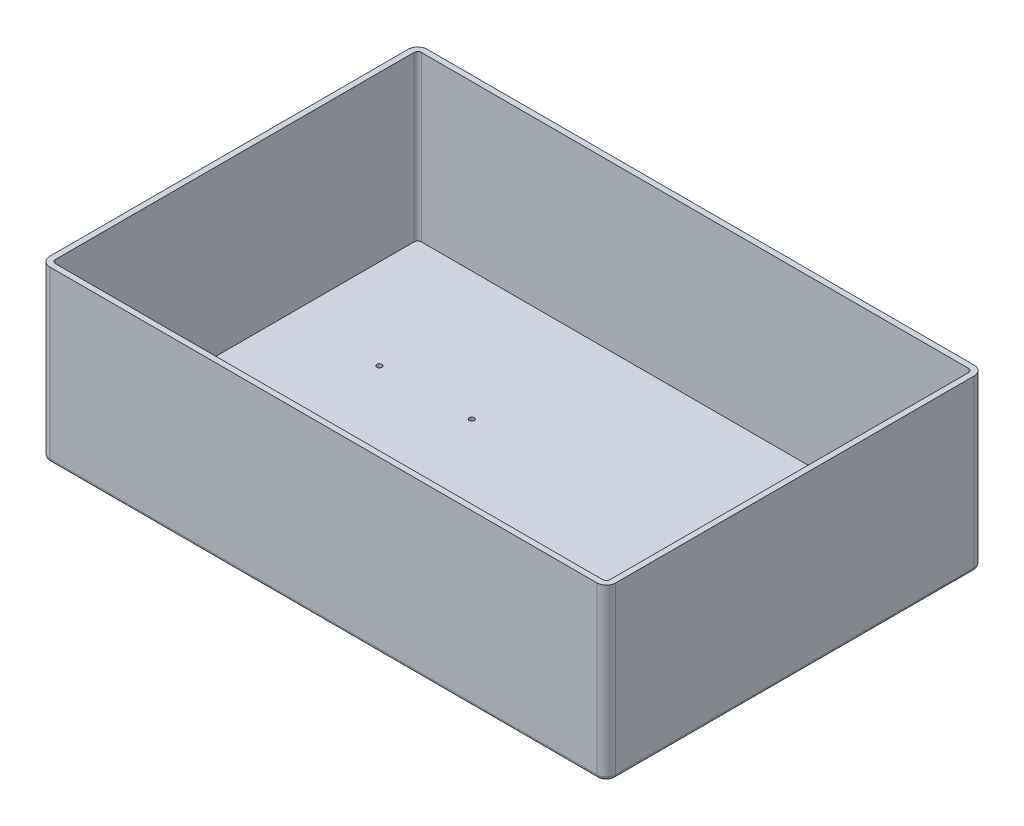
ISO-10303-21;
HEADER;
FILE_DESCRIPTION(('STEP AP214'),'2;1');
FILE_NAME('part.step','',(''),(''),'','','');
FILE_SCHEMA(('AUTOMOTIVE_DESIGN { 1 0 10303 214 1 1 1 1 }'));
ENDSEC;
DATA;
#1=APPLICATION_CONTEXT('core data for automotive mechanical design processes');
#2=APPLICATION_PROTOCOL_DEFINITION('international standard','automotive_design',2000,#1);
#3=PRODUCT_CONTEXT('',#1,'mechanical');
#4=PRODUCT('Part','Part','',(#3));
#5=PRODUCT_RELATED_PRODUCT_CATEGORY('part','',(#4));
#6=PRODUCT_DEFINITION_FORMATION('','',#4);
#7=PRODUCT_DEFINITION_CONTEXT('part definition',#1,'design');
#8=PRODUCT_DEFINITION('design','',#6,#7);
#9=PRODUCT_DEFINITION_SHAPE('','',#8);
#10=(LENGTH_UNIT() NAMED_UNIT(*) SI_UNIT(.MILLI.,.METRE.));
#11=(NAMED_UNIT(*) PLANE_ANGLE_UNIT() SI_UNIT($,.RADIAN.));
#12=(NAMED_UNIT(*) SI_UNIT($,.STERADIAN.) SOLID_ANGLE_UNIT());
#13=UNCERTAINTY_MEASURE_WITH_UNIT(LENGTH_MEASURE(1.E-05),#10,'distance_accuracy_value','');
#14=(GEOMETRIC_REPRESENTATION_CONTEXT(3) GLOBAL_UNCERTAINTY_ASSIGNED_CONTEXT((#13)) GLOBAL_UNIT_ASSIGNED_CONTEXT((#10,
#11,#12)) REPRESENTATION_CONTEXT('',''));
#15=CARTESIAN_POINT('',(0.,0.,0.));
#16=DIRECTION('',(0.,0.,1.));
#17=DIRECTION('',(1.,0.,0.));
#18=AXIS2_PLACEMENT_3D('',#15,#16,#17);
#19=CARTESIAN_POINT('',(-145.,90.,95.));
#20=DIRECTION('',(0.,-1.,0.));
#21=DIRECTION('',(0.,0.,-1.));
#22=AXIS2_PLACEMENT_3D('',#19,#20,#21);
#23=CYLINDRICAL_SURFACE('',#22,5.);
#24=DIRECTION('',(0.,-1.,0.));
#25=VECTOR('',#24,1.);
#26=CARTESIAN_POINT('',(-150.,90.,95.));
#27=LINE('',#26,#25);
#28=CARTESIAN_POINT('',(-150.,90.,95.));
#29=VERTEX_POINT('',#28);
#30=CARTESIAN_POINT('',(-150.,2.00000000000003,95.));
#31=VERTEX_POINT('',#30);
#32=EDGE_CURVE('E259',#29,#31,#27,.T.);
#33=ORIENTED_EDGE('',*,*,#32,.T.);
#34=CARTESIAN_POINT('',(-145.,1.99999999999999,95.));
#35=DIRECTION('',(0.,1.,0.));
#36=DIRECTION('',(0.,0.,1.));
#37=AXIS2_PLACEMENT_3D('',#34,#35,#36);
#38=CIRCLE('',#37,5.);
#39=CARTESIAN_POINT('',(-145.,2.00000000000003,100.));
#40=VERTEX_POINT('',#39);
#41=EDGE_CURVE('E280',#31,#40,#38,.T.);
#42=ORIENTED_EDGE('',*,*,#41,.T.);
#43=DIRECTION('',(0.,-1.,0.));
#44=VECTOR('',#43,1.);
#45=CARTESIAN_POINT('',(-145.,90.,100.));
#46=LINE('',#45,#44);
#47=CARTESIAN_POINT('',(-145.,90.,100.));
#48=VERTEX_POINT('',#47);
#49=EDGE_CURVE('E278',#48,#40,#46,.T.);
#50=ORIENTED_EDGE('',*,*,#49,.F.);
#51=CARTESIAN_POINT('',(-145.,90.,95.));
#52=DIRECTION('',(0.,1.,0.));
#53=DIRECTION('',(0.,0.,1.));
#54=AXIS2_PLACEMENT_3D('',#51,#52,#53);
#55=CIRCLE('',#54,5.);
#56=EDGE_CURVE('E242',#29,#48,#55,.T.);
#57=ORIENTED_EDGE('',*,*,#56,.F.);
#58=EDGE_LOOP('',(#33,#42,#50,#57));
#59=FACE_BOUND('',#58,.T.);
#60=ADVANCED_FACE('F37',(#59),#23,.T.);
#61=CARTESIAN_POINT('',(-145.,90.,100.));
#62=DIRECTION('',(0.,0.,-1.));
#63=DIRECTION('',(-1.,0.,0.));
#64=AXIS2_PLACEMENT_3D('',#61,#62,#63);
#65=PLANE('',#64);
#66=ORIENTED_EDGE('',*,*,#49,.T.);
#67=DIRECTION('',(1.,0.,0.));
#68=VECTOR('',#67,1.);
#69=CARTESIAN_POINT('',(-145.,2.,100.));
#70=LINE('',#69,#68);
#71=CARTESIAN_POINT('',(145.,2.00000000000003,100.));
#72=VERTEX_POINT('',#71);
#73=EDGE_CURVE('E11',#40,#72,#70,.T.);
#74=ORIENTED_EDGE('',*,*,#73,.T.);
#75=DIRECTION('',(0.,-1.,0.));
#76=VECTOR('',#75,1.);
#77=CARTESIAN_POINT('',(145.,90.,100.));
#78=LINE('',#77,#76);
#79=CARTESIAN_POINT('',(145.,90.,100.));
#80=VERTEX_POINT('',#79);
#81=EDGE_CURVE('E276',#80,#72,#78,.T.);
#82=ORIENTED_EDGE('',*,*,#81,.F.);
#83=DIRECTION('',(1.,0.,0.));
#84=VECTOR('',#83,1.);
#85=CARTESIAN_POINT('',(-145.,90.,100.));
#86=LINE('',#85,#84);
#87=EDGE_CURVE('E245',#48,#80,#86,.T.);
#88=ORIENTED_EDGE('',*,*,#87,.F.);
#89=EDGE_LOOP('',(#66,#74,#82,#88));
#90=FACE_BOUND('',#89,.T.);
#91=ADVANCED_FACE('F383',(#90),#65,.F.);
#92=CARTESIAN_POINT('',(145.,90.,95.));
#93=DIRECTION('',(0.,-1.,0.));
#94=DIRECTION('',(0.,0.,-1.));
#95=AXIS2_PLACEMENT_3D('',#92,#93,#94);
#96=CYLINDRICAL_SURFACE('',#95,5.);
#97=ORIENTED_EDGE('',*,*,#81,.T.);
#98=CARTESIAN_POINT('',(145.,1.99999999999999,95.));
#99=DIRECTION('',(0.,1.,0.));
#100=DIRECTION('',(0.,0.,1.));
#101=AXIS2_PLACEMENT_3D('',#98,#99,#100);
#102=CIRCLE('',#101,5.);
#103=CARTESIAN_POINT('',(150.,2.00000000000002,95.));
#104=VERTEX_POINT('',#103);
#105=EDGE_CURVE('E46',#72,#104,#102,.T.);
#106=ORIENTED_EDGE('',*,*,#105,.T.);
#107=DIRECTION('',(0.,-1.,0.));
#108=VECTOR('',#107,1.);
#109=CARTESIAN_POINT('',(150.,90.,95.));
#110=LINE('',#109,#108);
#111=CARTESIAN_POINT('',(150.,90.,95.));
#112=VERTEX_POINT('',#111);
#113=EDGE_CURVE('E274',#112,#104,#110,.T.);
#114=ORIENTED_EDGE('',*,*,#113,.F.);
#115=CARTESIAN_POINT('',(145.,90.,95.));
#116=DIRECTION('',(0.,1.,0.));
#117=DIRECTION('',(0.,0.,1.));
#118=AXIS2_PLACEMENT_3D('',#115,#116,#117);
#119=CIRCLE('',#118,5.);
#120=EDGE_CURVE('E247',#80,#112,#119,.T.);
#121=ORIENTED_EDGE('',*,*,#120,.F.);
#122=EDGE_LOOP('',(#97,#106,#114,#121));
#123=FACE_BOUND('',#122,.T.);
#124=ADVANCED_FACE('F389',(#123),#96,.T.);
#125=CARTESIAN_POINT('',(150.,90.,-95.));
#126=DIRECTION('',(-1.,0.,0.));
#127=DIRECTION('',(0.,0.,1.));
#128=AXIS2_PLACEMENT_3D('',#125,#126,#127);
#129=PLANE('',#128);
#130=ORIENTED_EDGE('',*,*,#113,.T.);
#131=DIRECTION('',(0.,0.,-1.));
#132=VECTOR('',#131,1.);
#133=CARTESIAN_POINT('',(150.,2.,-95.));
#134=LINE('',#133,#132);
#135=CARTESIAN_POINT('',(150.,2.00000000000003,-95.));
#136=VERTEX_POINT('',#135);
#137=EDGE_CURVE('E308',#104,#136,#134,.T.);
#138=ORIENTED_EDGE('',*,*,#137,.T.);
#139=DIRECTION('',(0.,-1.,0.));
#140=VECTOR('',#139,1.);
#141=CARTESIAN_POINT('',(150.,90.,-95.));
#142=LINE('',#141,#140);
#143=CARTESIAN_POINT('',(150.,90.,-95.));
#144=VERTEX_POINT('',#143);
#145=EDGE_CURVE('E271',#144,#136,#142,.T.);
#146=ORIENTED_EDGE('',*,*,#145,.F.);
#147=DIRECTION('',(0.,0.,-1.));
#148=VECTOR('',#147,1.);
#149=CARTESIAN_POINT('',(150.,90.,-95.));
#150=LINE('',#149,#148);
#151=EDGE_CURVE('E249',#112,#144,#150,.T.);
#152=ORIENTED_EDGE('',*,*,#151,.F.);
#153=EDGE_LOOP('',(#130,#138,#146,#152));
#154=FACE_BOUND('',#153,.T.);
#155=ADVANCED_FACE('F460',(#154),#129,.F.);
#156=CARTESIAN_POINT('',(145.,90.,-95.));
#157=DIRECTION('',(0.,-1.,0.));
#158=DIRECTION('',(0.,0.,-1.));
#159=AXIS2_PLACEMENT_3D('',#156,#157,#158);
#160=CYLINDRICAL_SURFACE('',#159,5.);
#161=ORIENTED_EDGE('',*,*,#145,.T.);
#162=CARTESIAN_POINT('',(145.,1.99999999999999,-95.));
#163=DIRECTION('',(0.,1.,0.));
#164=DIRECTION('',(0.,0.,1.));
#165=AXIS2_PLACEMENT_3D('',#162,#163,#164);
#166=CIRCLE('',#165,5.);
#167=CARTESIAN_POINT('',(145.,2.00000000000002,-100.));
#168=VERTEX_POINT('',#167);
#169=EDGE_CURVE('E306',#136,#168,#166,.T.);
#170=ORIENTED_EDGE('',*,*,#169,.T.);
#171=DIRECTION('',(0.,-1.,0.));
#172=VECTOR('',#171,1.);
#173=CARTESIAN_POINT('',(145.,90.,-100.));
#174=LINE('',#173,#172);
#175=CARTESIAN_POINT('',(145.,90.,-100.));
#176=VERTEX_POINT('',#175);
#177=EDGE_CURVE('E268',#176,#168,#174,.T.);
#178=ORIENTED_EDGE('',*,*,#177,.F.);
#179=CARTESIAN_POINT('',(145.,90.,-95.));
#180=DIRECTION('',(0.,1.,0.));
#181=DIRECTION('',(0.,0.,-1.));
#182=AXIS2_PLACEMENT_3D('',#179,#180,#181);
#183=CIRCLE('',#182,5.);
#184=EDGE_CURVE('E251',#144,#176,#183,.T.);
#185=ORIENTED_EDGE('',*,*,#184,.F.);
#186=EDGE_LOOP('',(#161,#170,#178,#185));
#187=FACE_BOUND('',#186,.T.);
#188=ADVANCED_FACE('F456',(#187),#160,.T.);
#189=CARTESIAN_POINT('',(-145.,90.,-100.));
#190=DIRECTION('',(0.,0.,1.));
#191=DIRECTION('',(1.,0.,0.));
#192=AXIS2_PLACEMENT_3D('',#189,#190,#191);
#193=PLANE('',#192);
#194=ORIENTED_EDGE('',*,*,#177,.T.);
#195=DIRECTION('',(-1.,0.,0.));
#196=VECTOR('',#195,1.);
#197=CARTESIAN_POINT('',(-145.,2.,-100.));
#198=LINE('',#197,#196);
#199=CARTESIAN_POINT('',(-145.,2.00000000000003,-100.));
#200=VERTEX_POINT('',#199);
#201=EDGE_CURVE('E304',#168,#200,#198,.T.);
#202=ORIENTED_EDGE('',*,*,#201,.T.);
#203=DIRECTION('',(0.,-1.,0.));
#204=VECTOR('',#203,1.);
#205=CARTESIAN_POINT('',(-145.,90.,-100.));
#206=LINE('',#205,#204);
#207=CARTESIAN_POINT('',(-145.,90.,-100.));
#208=VERTEX_POINT('',#207);
#209=EDGE_CURVE('E265',#208,#200,#206,.T.);
#210=ORIENTED_EDGE('',*,*,#209,.F.);
#211=DIRECTION('',(-1.,0.,0.));
#212=VECTOR('',#211,1.);
#213=CARTESIAN_POINT('',(-145.,90.,-100.));
#214=LINE('',#213,#212);
#215=EDGE_CURVE('E253',#176,#208,#214,.T.);
#216=ORIENTED_EDGE('',*,*,#215,.F.);
#217=EDGE_LOOP('',(#194,#202,#210,#216));
#218=FACE_BOUND('',#217,.T.);
#219=ADVANCED_FACE('F454',(#218),#193,.F.);
#220=CARTESIAN_POINT('',(-145.,90.,-95.));
#221=DIRECTION('',(0.,-1.,0.));
#222=DIRECTION('',(0.,0.,-1.));
#223=AXIS2_PLACEMENT_3D('',#220,#221,#222);
#224=CYLINDRICAL_SURFACE('',#223,5.);
#225=ORIENTED_EDGE('',*,*,#209,.T.);
#226=CARTESIAN_POINT('',(-145.,1.99999999999999,-95.));
#227=DIRECTION('',(0.,1.,0.));
#228=DIRECTION('',(0.,0.,1.));
#229=AXIS2_PLACEMENT_3D('',#226,#227,#228);
#230=CIRCLE('',#229,5.);
#231=CARTESIAN_POINT('',(-150.,2.00000000000002,-95.));
#232=VERTEX_POINT('',#231);
#233=EDGE_CURVE('E302',#200,#232,#230,.T.);
#234=ORIENTED_EDGE('',*,*,#233,.T.);
#235=DIRECTION('',(0.,-1.,0.));
#236=VECTOR('',#235,1.);
#237=CARTESIAN_POINT('',(-150.,90.,-95.));
#238=LINE('',#237,#236);
#239=CARTESIAN_POINT('',(-150.,90.,-95.));
#240=VERTEX_POINT('',#239);
#241=EDGE_CURVE('E262',#240,#232,#238,.T.);
#242=ORIENTED_EDGE('',*,*,#241,.F.);
#243=CARTESIAN_POINT('',(-145.,90.,-95.));
#244=DIRECTION('',(0.,1.,0.));
#245=DIRECTION('',(0.,0.,1.));
#246=AXIS2_PLACEMENT_3D('',#243,#244,#245);
#247=CIRCLE('',#246,5.);
#248=EDGE_CURVE('E255',#208,#240,#247,.T.);
#249=ORIENTED_EDGE('',*,*,#248,.F.);
#250=EDGE_LOOP('',(#225,#234,#242,#249));
#251=FACE_BOUND('',#250,.T.);
#252=ADVANCED_FACE('F441',(#251),#224,.T.);
#253=CARTESIAN_POINT('',(-150.,90.,-95.));
#254=DIRECTION('',(1.,0.,0.));
#255=DIRECTION('',(0.,0.,-1.));
#256=AXIS2_PLACEMENT_3D('',#253,#254,#255);
#257=PLANE('',#256);
#258=ORIENTED_EDGE('',*,*,#241,.T.);
#259=DIRECTION('',(0.,0.,1.));
#260=VECTOR('',#259,1.);
#261=CARTESIAN_POINT('',(-150.,2.,-95.));
#262=LINE('',#261,#260);
#263=EDGE_CURVE('E300',#232,#31,#262,.T.);
#264=ORIENTED_EDGE('',*,*,#263,.T.);
#265=ORIENTED_EDGE('',*,*,#32,.F.);
#266=DIRECTION('',(0.,0.,1.));
#267=VECTOR('',#266,1.);
#268=CARTESIAN_POINT('',(-150.,90.,-95.));
#269=LINE('',#268,#267);
#270=EDGE_CURVE('E257',#240,#29,#269,.T.);
#271=ORIENTED_EDGE('',*,*,#270,.F.);
#272=EDGE_LOOP('',(#258,#264,#265,#271));
#273=FACE_BOUND('',#272,.T.);
#274=ADVANCED_FACE('F446',(#273),#257,.F.);
#275=CARTESIAN_POINT('',(-145.,90.,95.));
#276=DIRECTION('',(0.,1.,0.));
#277=DIRECTION('',(0.,0.,1.));
#278=AXIS2_PLACEMENT_3D('',#275,#276,#277);
#279=PLANE('',#278);
#280=CARTESIAN_POINT('',(-145.,90.,95.));
#281=DIRECTION('',(0.,1.,0.));
#282=DIRECTION('',(0.,0.,1.));
#283=AXIS2_PLACEMENT_3D('',#280,#281,#282);
#284=CIRCLE('',#283,2.);
#285=CARTESIAN_POINT('',(-147.,90.,95.));
#286=VERTEX_POINT('',#285);
#287=CARTESIAN_POINT('',(-145.,90.,97.));
#288=VERTEX_POINT('',#287);
#289=EDGE_CURVE('E226',#286,#288,#284,.T.);
#290=ORIENTED_EDGE('',*,*,#289,.F.);
#291=DIRECTION('',(0.,0.,1.));
#292=VECTOR('',#291,1.);
#293=CARTESIAN_POINT('',(-147.,90.,-95.));
#294=LINE('',#293,#292);
#295=CARTESIAN_POINT('',(-147.,90.,-95.));
#296=VERTEX_POINT('',#295);
#297=EDGE_CURVE('E240',#296,#286,#294,.T.);
#298=ORIENTED_EDGE('',*,*,#297,.F.);
#299=CARTESIAN_POINT('',(-145.,90.,-95.));
#300=DIRECTION('',(0.,1.,0.));
#301=DIRECTION('',(0.,0.,1.));
#302=AXIS2_PLACEMENT_3D('',#299,#300,#301);
#303=CIRCLE('',#302,2.);
#304=CARTESIAN_POINT('',(-145.,90.,-97.));
#305=VERTEX_POINT('',#304);
#306=EDGE_CURVE('E237',#305,#296,#303,.T.);
#307=ORIENTED_EDGE('',*,*,#306,.F.);
#308=DIRECTION('',(-1.,0.,0.));
#309=VECTOR('',#308,1.);
#310=CARTESIAN_POINT('',(-145.,90.,-97.));
#311=LINE('',#310,#309);
#312=CARTESIAN_POINT('',(145.,90.,-97.));
#313=VERTEX_POINT('',#312);
#314=EDGE_CURVE('E235',#313,#305,#311,.T.);
#315=ORIENTED_EDGE('',*,*,#314,.F.);
#316=CARTESIAN_POINT('',(145.,90.,-95.));
#317=DIRECTION('',(0.,1.,0.));
#318=DIRECTION('',(0.,0.,1.));
#319=AXIS2_PLACEMENT_3D('',#316,#317,#318);
#320=CIRCLE('',#319,2.);
#321=CARTESIAN_POINT('',(147.,90.,-95.));
#322=VERTEX_POINT('',#321);
#323=EDGE_CURVE('E233',#322,#313,#320,.T.);
#324=ORIENTED_EDGE('',*,*,#323,.F.);
#325=DIRECTION('',(0.,0.,-1.));
#326=VECTOR('',#325,1.);
#327=CARTESIAN_POINT('',(147.,90.,-95.));
#328=LINE('',#327,#326);
#329=CARTESIAN_POINT('',(147.,90.,95.));
#330=VERTEX_POINT('',#329);
#331=EDGE_CURVE('E231',#330,#322,#328,.T.);
#332=ORIENTED_EDGE('',*,*,#331,.F.);
#333=CARTESIAN_POINT('',(145.,90.,95.));
#334=DIRECTION('',(0.,1.,0.));
#335=DIRECTION('',(0.,0.,1.));
#336=AXIS2_PLACEMENT_3D('',#333,#334,#335);
#337=CIRCLE('',#336,2.);
#338=CARTESIAN_POINT('',(145.,90.,97.));
#339=VERTEX_POINT('',#338);
#340=EDGE_CURVE('E229',#339,#330,#337,.T.);
#341=ORIENTED_EDGE('',*,*,#340,.F.);
#342=DIRECTION('',(1.,0.,0.));
#343=VECTOR('',#342,1.);
#344=CARTESIAN_POINT('',(-145.,90.,97.));
#345=LINE('',#344,#343);
#346=EDGE_CURVE('E191',#288,#339,#345,.T.);
#347=ORIENTED_EDGE('',*,*,#346,.F.);
#348=EDGE_LOOP('',(#290,#298,#307,#315,#324,#332,#341,#347));
#349=FACE_BOUND('',#348,.T.);
#350=ORIENTED_EDGE('',*,*,#56,.T.);
#351=ORIENTED_EDGE('',*,*,#87,.T.);
#352=ORIENTED_EDGE('',*,*,#120,.T.);
#353=ORIENTED_EDGE('',*,*,#151,.T.);
#354=ORIENTED_EDGE('',*,*,#184,.T.);
#355=ORIENTED_EDGE('',*,*,#215,.T.);
#356=ORIENTED_EDGE('',*,*,#248,.T.);
#357=ORIENTED_EDGE('',*,*,#270,.T.);
#358=EDGE_LOOP('',(#350,#351,#352,#353,#354,#355,#356,#357));
#359=FACE_BOUND('',#358,.T.);
#360=ADVANCED_FACE('F354',(#349,#359),#279,.T.);
#361=CARTESIAN_POINT('',(-145.,0.,95.));
#362=DIRECTION('',(0.,1.,0.));
#363=DIRECTION('',(0.,0.,1.));
#364=AXIS2_PLACEMENT_3D('',#361,#362,#363);
#365=PLANE('',#364);
#366=CARTESIAN_POINT('',(87.0505914378077,0.,12.235));
#367=DIRECTION('',(0.,1.,0.));
#368=DIRECTION('',(0.,0.,1.));
#369=AXIS2_PLACEMENT_3D('',#366,#367,#368);
#370=CIRCLE('',#369,1.35000000000001);
#371=CARTESIAN_POINT('',(87.0505914378077,0.,13.585));
#372=VERTEX_POINT('',#371);
#373=EDGE_CURVE('E712',#372,#372,#370,.T.);
#374=ORIENTED_EDGE('',*,*,#373,.T.);
#375=EDGE_LOOP('',(#374));
#376=FACE_BOUND('',#375,.T.);
#377=CARTESIAN_POINT('',(-99.3155914378077,0.,-29.));
#378=DIRECTION('',(0.,1.,0.));
#379=DIRECTION('',(0.,0.,1.));
#380=AXIS2_PLACEMENT_3D('',#377,#378,#379);
#381=CIRCLE('',#380,1.35000000000001);
#382=CARTESIAN_POINT('',(-99.3155914378077,0.,-27.65));
#383=VERTEX_POINT('',#382);
#384=EDGE_CURVE('E736',#383,#383,#381,.T.);
#385=ORIENTED_EDGE('',*,*,#384,.T.);
#386=EDGE_LOOP('',(#385));
#387=FACE_BOUND('',#386,.T.);
#388=CARTESIAN_POINT('',(-50.3155914378077,0.,-29.));
#389=DIRECTION('',(0.,1.,0.));
#390=DIRECTION('',(0.,0.,1.));
#391=AXIS2_PLACEMENT_3D('',#388,#389,#390);
#392=CIRCLE('',#391,1.35);
#393=CARTESIAN_POINT('',(-50.3155914378077,0.,-27.65));
#394=VERTEX_POINT('',#393);
#395=EDGE_CURVE('E731',#394,#394,#392,.T.);
#396=ORIENTED_EDGE('',*,*,#395,.T.);
#397=EDGE_LOOP('',(#396));
#398=FACE_BOUND('',#397,.T.);
#399=CARTESIAN_POINT('',(-50.3155914378077,0.,29.));
#400=DIRECTION('',(0.,1.,0.));
#401=DIRECTION('',(0.,0.,1.));
#402=AXIS2_PLACEMENT_3D('',#399,#400,#401);
#403=CIRCLE('',#402,1.35);
#404=CARTESIAN_POINT('',(-50.3155914378077,0.,30.35));
#405=VERTEX_POINT('',#404);
#406=EDGE_CURVE('E725',#405,#405,#403,.T.);
#407=ORIENTED_EDGE('',*,*,#406,.T.);
#408=EDGE_LOOP('',(#407));
#409=FACE_BOUND('',#408,.T.);
#410=CARTESIAN_POINT('',(87.0505914378077,0.,-12.235));
#411=DIRECTION('',(0.,1.,0.));
#412=DIRECTION('',(0.,0.,1.));
#413=AXIS2_PLACEMENT_3D('',#410,#411,#412);
#414=CIRCLE('',#413,1.35000000000001);
#415=CARTESIAN_POINT('',(87.0505914378077,0.,-10.885));
#416=VERTEX_POINT('',#415);
#417=EDGE_CURVE('E716',#416,#416,#414,.T.);
#418=ORIENTED_EDGE('',*,*,#417,.T.);
#419=EDGE_LOOP('',(#418));
#420=FACE_BOUND('',#419,.T.);
#421=CARTESIAN_POINT('',(62.5805914378077,0.,-12.235));
#422=DIRECTION('',(0.,1.,0.));
#423=DIRECTION('',(0.,0.,1.));
#424=AXIS2_PLACEMENT_3D('',#421,#422,#423);
#425=CIRCLE('',#424,1.35000000000001);
#426=CARTESIAN_POINT('',(62.5805914378077,0.,-10.885));
#427=VERTEX_POINT('',#426);
#428=EDGE_CURVE('E761',#427,#427,#425,.T.);
#429=ORIENTED_EDGE('',*,*,#428,.T.);
#430=EDGE_LOOP('',(#429));
#431=FACE_BOUND('',#430,.T.);
#432=CARTESIAN_POINT('',(62.5805914378077,0.,12.235));
#433=DIRECTION('',(0.,1.,0.));
#434=DIRECTION('',(0.,0.,1.));
#435=AXIS2_PLACEMENT_3D('',#432,#433,#434);
#436=CIRCLE('',#435,1.35000000000001);
#437=CARTESIAN_POINT('',(62.5805914378077,0.,13.585));
#438=VERTEX_POINT('',#437);
#439=EDGE_CURVE('E755',#438,#438,#436,.T.);
#440=ORIENTED_EDGE('',*,*,#439,.T.);
#441=EDGE_LOOP('',(#440));
#442=FACE_BOUND('',#441,.T.);
#443=CARTESIAN_POINT('',(-99.3155914378077,0.,29.));
#444=DIRECTION('',(0.,1.,0.));
#445=DIRECTION('',(0.,0.,1.));
#446=AXIS2_PLACEMENT_3D('',#443,#444,#445);
#447=CIRCLE('',#446,1.35000000000001);
#448=CARTESIAN_POINT('',(-99.3155914378077,0.,30.35));
#449=VERTEX_POINT('',#448);
#450=EDGE_CURVE('E314',#449,#449,#447,.T.);
#451=ORIENTED_EDGE('',*,*,#450,.T.);
#452=EDGE_LOOP('',(#451));
#453=FACE_BOUND('',#452,.T.);
#454=DIRECTION('',(1.,0.,0.));
#455=VECTOR('',#454,1.);
#456=CARTESIAN_POINT('',(-145.,0.,98.));
#457=LINE('',#456,#455);
#458=CARTESIAN_POINT('',(145.,0.,98.));
#459=VERTEX_POINT('',#458);
#460=CARTESIAN_POINT('',(-145.,0.,98.));
#461=VERTEX_POINT('',#460);
#462=EDGE_CURVE('E283',#459,#461,#457,.F.);
#463=ORIENTED_EDGE('',*,*,#462,.T.);
#464=CARTESIAN_POINT('',(-145.,0.,95.));
#465=DIRECTION('',(0.,1.,0.));
#466=DIRECTION('',(0.,0.,1.));
#467=AXIS2_PLACEMENT_3D('',#464,#465,#466);
#468=CIRCLE('',#467,3.);
#469=CARTESIAN_POINT('',(-148.,0.,95.));
#470=VERTEX_POINT('',#469);
#471=EDGE_CURVE('E297',#461,#470,#468,.F.);
#472=ORIENTED_EDGE('',*,*,#471,.T.);
#473=DIRECTION('',(0.,0.,1.));
#474=VECTOR('',#473,1.);
#475=CARTESIAN_POINT('',(-148.,0.,95.));
#476=LINE('',#475,#474);
#477=CARTESIAN_POINT('',(-148.,0.,-95.));
#478=VERTEX_POINT('',#477);
#479=EDGE_CURVE('E295',#470,#478,#476,.F.);
#480=ORIENTED_EDGE('',*,*,#479,.T.);
#481=CARTESIAN_POINT('',(-145.,0.,-95.));
#482=DIRECTION('',(0.,1.,0.));
#483=DIRECTION('',(0.,0.,1.));
#484=AXIS2_PLACEMENT_3D('',#481,#482,#483);
#485=CIRCLE('',#484,3.);
#486=CARTESIAN_POINT('',(-145.,0.,-98.));
#487=VERTEX_POINT('',#486);
#488=EDGE_CURVE('E293',#478,#487,#485,.F.);
#489=ORIENTED_EDGE('',*,*,#488,.T.);
#490=DIRECTION('',(-1.,0.,0.));
#491=VECTOR('',#490,1.);
#492=CARTESIAN_POINT('',(-145.,0.,-98.));
#493=LINE('',#492,#491);
#494=CARTESIAN_POINT('',(145.,0.,-98.));
#495=VERTEX_POINT('',#494);
#496=EDGE_CURVE('E291',#487,#495,#493,.F.);
#497=ORIENTED_EDGE('',*,*,#496,.T.);
#498=CARTESIAN_POINT('',(145.,0.,-95.));
#499=DIRECTION('',(0.,1.,0.));
#500=DIRECTION('',(0.,0.,1.));
#501=AXIS2_PLACEMENT_3D('',#498,#499,#500);
#502=CIRCLE('',#501,3.);
#503=CARTESIAN_POINT('',(148.,0.,-95.));
#504=VERTEX_POINT('',#503);
#505=EDGE_CURVE('E289',#495,#504,#502,.F.);
#506=ORIENTED_EDGE('',*,*,#505,.T.);
#507=DIRECTION('',(0.,0.,-1.));
#508=VECTOR('',#507,1.);
#509=CARTESIAN_POINT('',(148.,0.,95.));
#510=LINE('',#509,#508);
#511=CARTESIAN_POINT('',(148.,0.,95.));
#512=VERTEX_POINT('',#511);
#513=EDGE_CURVE('E287',#504,#512,#510,.F.);
#514=ORIENTED_EDGE('',*,*,#513,.T.);
#515=CARTESIAN_POINT('',(145.,0.,95.));
#516=DIRECTION('',(0.,1.,0.));
#517=DIRECTION('',(0.,0.,1.));
#518=AXIS2_PLACEMENT_3D('',#515,#516,#517);
#519=CIRCLE('',#518,3.);
#520=EDGE_CURVE('E285',#512,#459,#519,.F.);
#521=ORIENTED_EDGE('',*,*,#520,.T.);
#522=EDGE_LOOP('',(#463,#472,#480,#489,#497,#506,#514,#521));
#523=FACE_BOUND('',#522,.T.);
#524=ADVANCED_FACE('F432',(#376,#387,#398,#409,#420,#431,#442,#453,#523),#365,.F.);
#525=CARTESIAN_POINT('',(-145.,90.,95.));
#526=DIRECTION('',(0.,-1.,0.));
#527=DIRECTION('',(0.,0.,-1.));
#528=AXIS2_PLACEMENT_3D('',#525,#526,#527);
#529=CYLINDRICAL_SURFACE('',#528,2.);
#530=CARTESIAN_POINT('',(-145.,3.,95.));
#531=DIRECTION('',(0.,1.,0.));
#532=DIRECTION('',(0.,0.,1.));
#533=AXIS2_PLACEMENT_3D('',#530,#531,#532);
#534=CIRCLE('',#533,2.);
#535=CARTESIAN_POINT('',(-147.,3.,95.));
#536=VERTEX_POINT('',#535);
#537=CARTESIAN_POINT('',(-145.,3.,97.));
#538=VERTEX_POINT('',#537);
#539=EDGE_CURVE('E182',#536,#538,#534,.T.);
#540=ORIENTED_EDGE('',*,*,#539,.F.);
#541=DIRECTION('',(0.,-1.,0.));
#542=VECTOR('',#541,1.);
#543=CARTESIAN_POINT('',(-147.,90.,95.));
#544=LINE('',#543,#542);
#545=EDGE_CURVE('E224',#286,#536,#544,.T.);
#546=ORIENTED_EDGE('',*,*,#545,.F.);
#547=ORIENTED_EDGE('',*,*,#289,.T.);
#548=DIRECTION('',(0.,1.,0.));
#549=VECTOR('',#548,1.);
#550=CARTESIAN_POINT('',(-145.,90.,97.));
#551=LINE('',#550,#549);
#552=EDGE_CURVE('E194',#288,#538,#551,.F.);
#553=ORIENTED_EDGE('',*,*,#552,.T.);
#554=EDGE_LOOP('',(#540,#546,#547,#553));
#555=FACE_BOUND('',#554,.T.);
#556=ADVANCED_FACE('F352',(#555),#529,.F.);
#557=CARTESIAN_POINT('',(-145.,90.,97.));
#558=DIRECTION('',(0.,0.,-1.));
#559=DIRECTION('',(-1.,0.,0.));
#560=AXIS2_PLACEMENT_3D('',#557,#558,#559);
#561=PLANE('',#560);
#562=DIRECTION('',(1.,0.,0.));
#563=VECTOR('',#562,1.);
#564=CARTESIAN_POINT('',(-145.,3.,97.));
#565=LINE('',#564,#563);
#566=CARTESIAN_POINT('',(145.,3.,97.));
#567=VERTEX_POINT('',#566);
#568=EDGE_CURVE('E175',#538,#567,#565,.T.);
#569=ORIENTED_EDGE('',*,*,#568,.F.);
#570=ORIENTED_EDGE('',*,*,#552,.F.);
#571=ORIENTED_EDGE('',*,*,#346,.T.);
#572=DIRECTION('',(0.,-1.,0.));
#573=VECTOR('',#572,1.);
#574=CARTESIAN_POINT('',(145.,90.,97.));
#575=LINE('',#574,#573);
#576=EDGE_CURVE('E188',#339,#567,#575,.T.);
#577=ORIENTED_EDGE('',*,*,#576,.T.);
#578=EDGE_LOOP('',(#569,#570,#571,#577));
#579=FACE_BOUND('',#578,.T.);
#580=ADVANCED_FACE('F189',(#579),#561,.T.);
#581=CARTESIAN_POINT('',(145.,90.,95.));
#582=DIRECTION('',(0.,-1.,0.));
#583=DIRECTION('',(0.,0.,-1.));
#584=AXIS2_PLACEMENT_3D('',#581,#582,#583);
#585=CYLINDRICAL_SURFACE('',#584,2.);
#586=CARTESIAN_POINT('',(145.,3.,95.));
#587=DIRECTION('',(0.,1.,0.));
#588=DIRECTION('',(0.,0.,1.));
#589=AXIS2_PLACEMENT_3D('',#586,#587,#588);
#590=CIRCLE('',#589,2.);
#591=CARTESIAN_POINT('',(147.,3.,95.));
#592=VERTEX_POINT('',#591);
#593=EDGE_CURVE('E179',#567,#592,#590,.T.);
#594=ORIENTED_EDGE('',*,*,#593,.F.);
#595=ORIENTED_EDGE('',*,*,#576,.F.);
#596=ORIENTED_EDGE('',*,*,#340,.T.);
#597=DIRECTION('',(0.,1.,0.));
#598=VECTOR('',#597,1.);
#599=CARTESIAN_POINT('',(147.,90.,95.));
#600=LINE('',#599,#598);
#601=EDGE_CURVE('E195',#330,#592,#600,.F.);
#602=ORIENTED_EDGE('',*,*,#601,.T.);
#603=EDGE_LOOP('',(#594,#595,#596,#602));
#604=FACE_BOUND('',#603,.T.);
#605=ADVANCED_FACE('F197',(#604),#585,.F.);
#606=CARTESIAN_POINT('',(147.,90.,-95.));
#607=DIRECTION('',(-1.,0.,0.));
#608=DIRECTION('',(0.,0.,1.));
#609=AXIS2_PLACEMENT_3D('',#606,#607,#608);
#610=PLANE('',#609);
#611=DIRECTION('',(0.,0.,-1.));
#612=VECTOR('',#611,1.);
#613=CARTESIAN_POINT('',(147.,3.,-95.));
#614=LINE('',#613,#612);
#615=CARTESIAN_POINT('',(147.,3.,-95.));
#616=VERTEX_POINT('',#615);
#617=EDGE_CURVE('E200',#592,#616,#614,.T.);
#618=ORIENTED_EDGE('',*,*,#617,.F.);
#619=ORIENTED_EDGE('',*,*,#601,.F.);
#620=ORIENTED_EDGE('',*,*,#331,.T.);
#621=DIRECTION('',(0.,-1.,0.));
#622=VECTOR('',#621,1.);
#623=CARTESIAN_POINT('',(147.,90.,-95.));
#624=LINE('',#623,#622);
#625=EDGE_CURVE('E205',#322,#616,#624,.T.);
#626=ORIENTED_EDGE('',*,*,#625,.T.);
#627=EDGE_LOOP('',(#618,#619,#620,#626));
#628=FACE_BOUND('',#627,.T.);
#629=ADVANCED_FACE('F359',(#628),#610,.T.);
#630=CARTESIAN_POINT('',(145.,90.,-95.));
#631=DIRECTION('',(0.,-1.,0.));
#632=DIRECTION('',(0.,0.,-1.));
#633=AXIS2_PLACEMENT_3D('',#630,#631,#632);
#634=CYLINDRICAL_SURFACE('',#633,2.);
#635=CARTESIAN_POINT('',(145.,3.,-95.));
#636=DIRECTION('',(0.,1.,0.));
#637=DIRECTION('',(0.,0.,1.));
#638=AXIS2_PLACEMENT_3D('',#635,#636,#637);
#639=CIRCLE('',#638,2.);
#640=CARTESIAN_POINT('',(145.,3.,-97.));
#641=VERTEX_POINT('',#640);
#642=EDGE_CURVE('E202',#616,#641,#639,.T.);
#643=ORIENTED_EDGE('',*,*,#642,.F.);
#644=ORIENTED_EDGE('',*,*,#625,.F.);
#645=ORIENTED_EDGE('',*,*,#323,.T.);
#646=DIRECTION('',(0.,1.,0.));
#647=VECTOR('',#646,1.);
#648=CARTESIAN_POINT('',(145.,90.,-97.));
#649=LINE('',#648,#647);
#650=EDGE_CURVE('E209',#313,#641,#649,.F.);
#651=ORIENTED_EDGE('',*,*,#650,.T.);
#652=EDGE_LOOP('',(#643,#644,#645,#651));
#653=FACE_BOUND('',#652,.T.);
#654=ADVANCED_FACE('F365',(#653),#634,.F.);
#655=CARTESIAN_POINT('',(-145.,90.,-97.));
#656=DIRECTION('',(0.,0.,1.));
#657=DIRECTION('',(1.,0.,0.));
#658=AXIS2_PLACEMENT_3D('',#655,#656,#657);
#659=PLANE('',#658);
#660=DIRECTION('',(-1.,0.,0.));
#661=VECTOR('',#660,1.);
#662=CARTESIAN_POINT('',(-145.,3.,-97.));
#663=LINE('',#662,#661);
#664=CARTESIAN_POINT('',(-145.,3.,-97.));
#665=VERTEX_POINT('',#664);
#666=EDGE_CURVE('E211',#641,#665,#663,.T.);
#667=ORIENTED_EDGE('',*,*,#666,.F.);
#668=ORIENTED_EDGE('',*,*,#650,.F.);
#669=ORIENTED_EDGE('',*,*,#314,.T.);
#670=DIRECTION('',(0.,-1.,0.));
#671=VECTOR('',#670,1.);
#672=CARTESIAN_POINT('',(-145.,90.,-97.));
#673=LINE('',#672,#671);
#674=EDGE_CURVE('E214',#305,#665,#673,.T.);
#675=ORIENTED_EDGE('',*,*,#674,.T.);
#676=EDGE_LOOP('',(#667,#668,#669,#675));
#677=FACE_BOUND('',#676,.T.);
#678=ADVANCED_FACE('F368',(#677),#659,.T.);
#679=CARTESIAN_POINT('',(-145.,90.,-95.));
#680=DIRECTION('',(0.,-1.,0.));
#681=DIRECTION('',(0.,0.,-1.));
#682=AXIS2_PLACEMENT_3D('',#679,#680,#681);
#683=CYLINDRICAL_SURFACE('',#682,2.);
#684=CARTESIAN_POINT('',(-145.,3.,-95.));
#685=DIRECTION('',(0.,1.,0.));
#686=DIRECTION('',(0.,0.,1.));
#687=AXIS2_PLACEMENT_3D('',#684,#685,#686);
#688=CIRCLE('',#687,2.);
#689=CARTESIAN_POINT('',(-147.,3.,-95.));
#690=VERTEX_POINT('',#689);
#691=EDGE_CURVE('E216',#665,#690,#688,.T.);
#692=ORIENTED_EDGE('',*,*,#691,.F.);
#693=ORIENTED_EDGE('',*,*,#674,.F.);
#694=ORIENTED_EDGE('',*,*,#306,.T.);
#695=DIRECTION('',(0.,1.,0.));
#696=VECTOR('',#695,1.);
#697=CARTESIAN_POINT('',(-147.,90.,-95.));
#698=LINE('',#697,#696);
#699=EDGE_CURVE('E219',#296,#690,#698,.F.);
#700=ORIENTED_EDGE('',*,*,#699,.T.);
#701=EDGE_LOOP('',(#692,#693,#694,#700));
#702=FACE_BOUND('',#701,.T.);
#703=ADVANCED_FACE('F373',(#702),#683,.F.);
#704=CARTESIAN_POINT('',(-147.,90.,-95.));
#705=DIRECTION('',(1.,0.,0.));
#706=DIRECTION('',(0.,0.,-1.));
#707=AXIS2_PLACEMENT_3D('',#704,#705,#706);
#708=PLANE('',#707);
#709=DIRECTION('',(0.,0.,1.));
#710=VECTOR('',#709,1.);
#711=CARTESIAN_POINT('',(-147.,3.,-95.));
#712=LINE('',#711,#710);
#713=EDGE_CURVE('E221',#690,#536,#712,.T.);
#714=ORIENTED_EDGE('',*,*,#713,.F.);
#715=ORIENTED_EDGE('',*,*,#699,.F.);
#716=ORIENTED_EDGE('',*,*,#297,.T.);
#717=ORIENTED_EDGE('',*,*,#545,.T.);
#718=EDGE_LOOP('',(#714,#715,#716,#717));
#719=FACE_BOUND('',#718,.T.);
#720=ADVANCED_FACE('F348',(#719),#708,.T.);
#721=CARTESIAN_POINT('',(-145.,3.,95.));
#722=DIRECTION('',(0.,1.,0.));
#723=DIRECTION('',(0.,0.,1.));
#724=AXIS2_PLACEMENT_3D('',#721,#722,#723);
#725=PLANE('',#724);
#726=CARTESIAN_POINT('',(87.0505914378077,3.,12.235));
#727=DIRECTION('',(0.,1.,0.));
#728=DIRECTION('',(0.,0.,1.));
#729=AXIS2_PLACEMENT_3D('',#726,#727,#728);
#730=CIRCLE('',#729,1.35000000000001);
#731=CARTESIAN_POINT('',(87.0505914378077,3.,13.585));
#732=VERTEX_POINT('',#731);
#733=EDGE_CURVE('E715',#732,#732,#730,.T.);
#734=ORIENTED_EDGE('',*,*,#733,.F.);
#735=EDGE_LOOP('',(#734));
#736=FACE_BOUND('',#735,.T.);
#737=CARTESIAN_POINT('',(-99.3155914378077,3.,-29.));
#738=DIRECTION('',(0.,1.,0.));
#739=DIRECTION('',(0.,0.,1.));
#740=AXIS2_PLACEMENT_3D('',#737,#738,#739);
#741=CIRCLE('',#740,1.35000000000001);
#742=CARTESIAN_POINT('',(-99.3155914378077,3.,-27.65));
#743=VERTEX_POINT('',#742);
#744=EDGE_CURVE('E718',#743,#743,#741,.T.);
#745=ORIENTED_EDGE('',*,*,#744,.F.);
#746=EDGE_LOOP('',(#745));
#747=FACE_BOUND('',#746,.T.);
#748=CARTESIAN_POINT('',(-50.3155914378077,3.,-29.));
#749=DIRECTION('',(0.,1.,0.));
#750=DIRECTION('',(0.,0.,1.));
#751=AXIS2_PLACEMENT_3D('',#748,#749,#750);
#752=CIRCLE('',#751,1.35);
#753=CARTESIAN_POINT('',(-50.3155914378077,3.,-27.65));
#754=VERTEX_POINT('',#753);
#755=EDGE_CURVE('E734',#754,#754,#752,.T.);
#756=ORIENTED_EDGE('',*,*,#755,.F.);
#757=EDGE_LOOP('',(#756));
#758=FACE_BOUND('',#757,.T.);
#759=CARTESIAN_POINT('',(-50.3155914378077,3.,29.));
#760=DIRECTION('',(0.,1.,0.));
#761=DIRECTION('',(0.,0.,1.));
#762=AXIS2_PLACEMENT_3D('',#759,#760,#761);
#763=CIRCLE('',#762,1.35);
#764=CARTESIAN_POINT('',(-50.3155914378077,3.,30.35));
#765=VERTEX_POINT('',#764);
#766=EDGE_CURVE('E728',#765,#765,#763,.T.);
#767=ORIENTED_EDGE('',*,*,#766,.F.);
#768=EDGE_LOOP('',(#767));
#769=FACE_BOUND('',#768,.T.);
#770=CARTESIAN_POINT('',(87.0505914378077,3.,-12.235));
#771=DIRECTION('',(0.,1.,0.));
#772=DIRECTION('',(0.,0.,1.));
#773=AXIS2_PLACEMENT_3D('',#770,#771,#772);
#774=CIRCLE('',#773,1.35000000000001);
#775=CARTESIAN_POINT('',(87.0505914378077,3.,-10.885));
#776=VERTEX_POINT('',#775);
#777=EDGE_CURVE('E721',#776,#776,#774,.T.);
#778=ORIENTED_EDGE('',*,*,#777,.F.);
#779=EDGE_LOOP('',(#778));
#780=FACE_BOUND('',#779,.T.);
#781=CARTESIAN_POINT('',(62.5805914378077,3.,-12.235));
#782=DIRECTION('',(0.,1.,0.));
#783=DIRECTION('',(0.,0.,1.));
#784=AXIS2_PLACEMENT_3D('',#781,#782,#783);
#785=CIRCLE('',#784,1.35000000000001);
#786=CARTESIAN_POINT('',(62.5805914378077,3.,-10.885));
#787=VERTEX_POINT('',#786);
#788=EDGE_CURVE('E758',#787,#787,#785,.T.);
#789=ORIENTED_EDGE('',*,*,#788,.F.);
#790=EDGE_LOOP('',(#789));
#791=FACE_BOUND('',#790,.T.);
#792=CARTESIAN_POINT('',(62.5805914378077,3.,12.235));
#793=DIRECTION('',(0.,1.,0.));
#794=DIRECTION('',(0.,0.,1.));
#795=AXIS2_PLACEMENT_3D('',#792,#793,#794);
#796=CIRCLE('',#795,1.35000000000001);
#797=CARTESIAN_POINT('',(62.5805914378077,3.,13.585));
#798=VERTEX_POINT('',#797);
#799=EDGE_CURVE('E752',#798,#798,#796,.T.);
#800=ORIENTED_EDGE('',*,*,#799,.F.);
#801=EDGE_LOOP('',(#800));
#802=FACE_BOUND('',#801,.T.);
#803=CARTESIAN_POINT('',(-99.3155914378077,3.,29.));
#804=DIRECTION('',(0.,1.,0.));
#805=DIRECTION('',(0.,0.,1.));
#806=AXIS2_PLACEMENT_3D('',#803,#804,#805);
#807=CIRCLE('',#806,1.35000000000001);
#808=CARTESIAN_POINT('',(-99.3155914378077,3.,30.35));
#809=VERTEX_POINT('',#808);
#810=EDGE_CURVE('E341',#809,#809,#807,.T.);
#811=ORIENTED_EDGE('',*,*,#810,.F.);
#812=EDGE_LOOP('',(#811));
#813=FACE_BOUND('',#812,.T.);
#814=ORIENTED_EDGE('',*,*,#539,.T.);
#815=ORIENTED_EDGE('',*,*,#568,.T.);
#816=ORIENTED_EDGE('',*,*,#593,.T.);
#817=ORIENTED_EDGE('',*,*,#617,.T.);
#818=ORIENTED_EDGE('',*,*,#642,.T.);
#819=ORIENTED_EDGE('',*,*,#666,.T.);
#820=ORIENTED_EDGE('',*,*,#691,.T.);
#821=ORIENTED_EDGE('',*,*,#713,.T.);
#822=EDGE_LOOP('',(#814,#815,#816,#817,#818,#819,#820,#821));
#823=FACE_BOUND('',#822,.T.);
#824=ADVANCED_FACE('F177',(#736,#747,#758,#769,#780,#791,#802,#813,#823),#725,.T.);
#825=CARTESIAN_POINT('',(145.,2.,-95.));
#826=DIRECTION('',(0.,1.,0.));
#827=DIRECTION('',(0.,0.,1.));
#828=AXIS2_PLACEMENT_3D('',#825,#826,#827);
#829=TOROIDAL_SURFACE('',#828,3.,2.);
#830=CARTESIAN_POINT('',(148.,2.,-95.));
#831=DIRECTION('',(0.,0.,1.));
#832=DIRECTION('',(1.,0.,0.));
#833=AXIS2_PLACEMENT_3D('',#830,#831,#832);
#834=CIRCLE('',#833,2.);
#835=EDGE_CURVE('E327',#504,#136,#834,.T.);
#836=ORIENTED_EDGE('',*,*,#835,.F.);
#837=ORIENTED_EDGE('',*,*,#505,.F.);
#838=CARTESIAN_POINT('',(145.,1.99999999999999,-98.));
#839=DIRECTION('',(-1.,0.,0.));
#840=DIRECTION('',(0.,0.,1.));
#841=AXIS2_PLACEMENT_3D('',#838,#839,#840);
#842=CIRCLE('',#841,2.);
#843=EDGE_CURVE('E41',#168,#495,#842,.T.);
#844=ORIENTED_EDGE('',*,*,#843,.F.);
#845=ORIENTED_EDGE('',*,*,#169,.F.);
#846=EDGE_LOOP('',(#836,#837,#844,#845));
#847=FACE_BOUND('',#846,.T.);
#848=ADVANCED_FACE('F39',(#847),#829,.T.);
#849=CARTESIAN_POINT('',(-145.,2.,-98.));
#850=DIRECTION('',(-1.,0.,0.));
#851=DIRECTION('',(0.,0.,1.));
#852=AXIS2_PLACEMENT_3D('',#849,#850,#851);
#853=CYLINDRICAL_SURFACE('',#852,2.);
#854=ORIENTED_EDGE('',*,*,#843,.T.);
#855=ORIENTED_EDGE('',*,*,#496,.F.);
#856=CARTESIAN_POINT('',(-145.,2.,-98.));
#857=DIRECTION('',(-1.,0.,0.));
#858=DIRECTION('',(0.,0.,1.));
#859=AXIS2_PLACEMENT_3D('',#856,#857,#858);
#860=CIRCLE('',#859,2.);
#861=EDGE_CURVE('E325',#200,#487,#860,.T.);
#862=ORIENTED_EDGE('',*,*,#861,.F.);
#863=ORIENTED_EDGE('',*,*,#201,.F.);
#864=EDGE_LOOP('',(#854,#855,#862,#863));
#865=FACE_BOUND('',#864,.T.);
#866=ADVANCED_FACE('F416',(#865),#853,.T.);
#867=CARTESIAN_POINT('',(148.,2.,-95.));
#868=DIRECTION('',(0.,0.,-1.));
#869=DIRECTION('',(-1.,0.,0.));
#870=AXIS2_PLACEMENT_3D('',#867,#868,#869);
#871=CYLINDRICAL_SURFACE('',#870,2.);
#872=ORIENTED_EDGE('',*,*,#835,.T.);
#873=ORIENTED_EDGE('',*,*,#137,.F.);
#874=CARTESIAN_POINT('',(148.,2.,95.));
#875=DIRECTION('',(0.,0.,1.));
#876=DIRECTION('',(1.,0.,0.));
#877=AXIS2_PLACEMENT_3D('',#874,#875,#876);
#878=CIRCLE('',#877,2.);
#879=EDGE_CURVE('E322',#512,#104,#878,.T.);
#880=ORIENTED_EDGE('',*,*,#879,.F.);
#881=ORIENTED_EDGE('',*,*,#513,.F.);
#882=EDGE_LOOP('',(#872,#873,#880,#881));
#883=FACE_BOUND('',#882,.T.);
#884=ADVANCED_FACE('F413',(#883),#871,.T.);
#885=CARTESIAN_POINT('',(-145.,2.,-95.));
#886=DIRECTION('',(0.,1.,0.));
#887=DIRECTION('',(0.,0.,1.));
#888=AXIS2_PLACEMENT_3D('',#885,#886,#887);
#889=TOROIDAL_SURFACE('',#888,3.,2.);
#890=ORIENTED_EDGE('',*,*,#861,.T.);
#891=ORIENTED_EDGE('',*,*,#488,.F.);
#892=CARTESIAN_POINT('',(-148.,1.99999999999999,-95.));
#893=DIRECTION('',(0.,0.,1.));
#894=DIRECTION('',(0.,-1.,0.));
#895=AXIS2_PLACEMENT_3D('',#892,#893,#894);
#896=CIRCLE('',#895,2.);
#897=EDGE_CURVE('E319',#232,#478,#896,.T.);
#898=ORIENTED_EDGE('',*,*,#897,.F.);
#899=ORIENTED_EDGE('',*,*,#233,.F.);
#900=EDGE_LOOP('',(#890,#891,#898,#899));
#901=FACE_BOUND('',#900,.T.);
#902=ADVANCED_FACE('F409',(#901),#889,.T.);
#903=CARTESIAN_POINT('',(145.,2.,95.));
#904=DIRECTION('',(0.,1.,0.));
#905=DIRECTION('',(0.,0.,1.));
#906=AXIS2_PLACEMENT_3D('',#903,#904,#905);
#907=TOROIDAL_SURFACE('',#906,3.,2.);
#908=ORIENTED_EDGE('',*,*,#879,.T.);
#909=ORIENTED_EDGE('',*,*,#105,.F.);
#910=CARTESIAN_POINT('',(145.,2.,98.));
#911=DIRECTION('',(-1.,0.,0.));
#912=DIRECTION('',(0.,0.,1.));
#913=AXIS2_PLACEMENT_3D('',#910,#911,#912);
#914=CIRCLE('',#913,2.);
#915=EDGE_CURVE('E316',#459,#72,#914,.T.);
#916=ORIENTED_EDGE('',*,*,#915,.F.);
#917=ORIENTED_EDGE('',*,*,#520,.F.);
#918=EDGE_LOOP('',(#908,#909,#916,#917));
#919=FACE_BOUND('',#918,.T.);
#920=ADVANCED_FACE('F405',(#919),#907,.T.);
#921=CARTESIAN_POINT('',(-148.,2.,-95.));
#922=DIRECTION('',(0.,0.,1.));
#923=DIRECTION('',(1.,0.,0.));
#924=AXIS2_PLACEMENT_3D('',#921,#922,#923);
#925=CYLINDRICAL_SURFACE('',#924,2.);
#926=ORIENTED_EDGE('',*,*,#897,.T.);
#927=ORIENTED_EDGE('',*,*,#479,.F.);
#928=CARTESIAN_POINT('',(-148.,2.,95.));
#929=DIRECTION('',(0.,0.,1.));
#930=DIRECTION('',(0.,-1.,0.));
#931=AXIS2_PLACEMENT_3D('',#928,#929,#930);
#932=CIRCLE('',#931,2.);
#933=EDGE_CURVE('E313',#31,#470,#932,.T.);
#934=ORIENTED_EDGE('',*,*,#933,.F.);
#935=ORIENTED_EDGE('',*,*,#263,.F.);
#936=EDGE_LOOP('',(#926,#927,#934,#935));
#937=FACE_BOUND('',#936,.T.);
#938=ADVANCED_FACE('F401',(#937),#925,.T.);
#939=CARTESIAN_POINT('',(-145.,2.,98.));
#940=DIRECTION('',(1.,0.,0.));
#941=DIRECTION('',(0.,0.,-1.));
#942=AXIS2_PLACEMENT_3D('',#939,#940,#941);
#943=CYLINDRICAL_SURFACE('',#942,2.);
#944=ORIENTED_EDGE('',*,*,#915,.T.);
#945=ORIENTED_EDGE('',*,*,#73,.F.);
#946=CARTESIAN_POINT('',(-145.,2.,98.));
#947=DIRECTION('',(-1.,0.,0.));
#948=DIRECTION('',(0.,0.,1.));
#949=AXIS2_PLACEMENT_3D('',#946,#947,#948);
#950=CIRCLE('',#949,2.);
#951=EDGE_CURVE('E311',#461,#40,#950,.T.);
#952=ORIENTED_EDGE('',*,*,#951,.F.);
#953=ORIENTED_EDGE('',*,*,#462,.F.);
#954=EDGE_LOOP('',(#944,#945,#952,#953));
#955=FACE_BOUND('',#954,.T.);
#956=ADVANCED_FACE('F397',(#955),#943,.T.);
#957=CARTESIAN_POINT('',(-145.,2.,95.));
#958=DIRECTION('',(0.,1.,0.));
#959=DIRECTION('',(0.,0.,1.));
#960=AXIS2_PLACEMENT_3D('',#957,#958,#959);
#961=TOROIDAL_SURFACE('',#960,3.,2.);
#962=ORIENTED_EDGE('',*,*,#933,.T.);
#963=ORIENTED_EDGE('',*,*,#471,.F.);
#964=ORIENTED_EDGE('',*,*,#951,.T.);
#965=ORIENTED_EDGE('',*,*,#41,.F.);
#966=EDGE_LOOP('',(#962,#963,#964,#965));
#967=FACE_BOUND('',#966,.T.);
#968=ADVANCED_FACE('F393',(#967),#961,.T.);
#969=CARTESIAN_POINT('',(-99.3155914378077,0.,29.));
#970=DIRECTION('',(0.,1.,0.));
#971=DIRECTION('',(0.,0.,1.));
#972=AXIS2_PLACEMENT_3D('',#969,#970,#971);
#973=CYLINDRICAL_SURFACE('',#972,1.35000000000001);
#974=ORIENTED_EDGE('',*,*,#450,.F.);
#975=EDGE_LOOP('',(#974));
#976=FACE_BOUND('',#975,.T.);
#977=ORIENTED_EDGE('',*,*,#810,.T.);
#978=EDGE_LOOP('',(#977));
#979=FACE_BOUND('',#978,.T.);
#980=ADVANCED_FACE('F396',(#976,#979),#973,.F.);
#981=CARTESIAN_POINT('',(62.5805914378077,0.,12.235));
#982=DIRECTION('',(0.,1.,0.));
#983=DIRECTION('',(0.,0.,1.));
#984=AXIS2_PLACEMENT_3D('',#981,#982,#983);
#985=CYLINDRICAL_SURFACE('',#984,1.35000000000001);
#986=ORIENTED_EDGE('',*,*,#439,.F.);
#987=EDGE_LOOP('',(#986));
#988=FACE_BOUND('',#987,.T.);
#989=ORIENTED_EDGE('',*,*,#799,.T.);
#990=EDGE_LOOP('',(#989));
#991=FACE_BOUND('',#990,.T.);
#992=ADVANCED_FACE('F635',(#988,#991),#985,.F.);
#993=CARTESIAN_POINT('',(62.5805914378077,0.,-12.235));
#994=DIRECTION('',(0.,1.,0.));
#995=DIRECTION('',(0.,0.,1.));
#996=AXIS2_PLACEMENT_3D('',#993,#994,#995);
#997=CYLINDRICAL_SURFACE('',#996,1.35000000000001);
#998=ORIENTED_EDGE('',*,*,#428,.F.);
#999=EDGE_LOOP('',(#998));
#1000=FACE_BOUND('',#999,.T.);
#1001=ORIENTED_EDGE('',*,*,#788,.T.);
#1002=EDGE_LOOP('',(#1001));
#1003=FACE_BOUND('',#1002,.T.);
#1004=ADVANCED_FACE('F642',(#1000,#1003),#997,.F.);
#1005=CARTESIAN_POINT('',(87.0505914378077,0.,-12.235));
#1006=DIRECTION('',(0.,1.,0.));
#1007=DIRECTION('',(0.,0.,1.));
#1008=AXIS2_PLACEMENT_3D('',#1005,#1006,#1007);
#1009=CYLINDRICAL_SURFACE('',#1008,1.35000000000001);
#1010=ORIENTED_EDGE('',*,*,#417,.F.);
#1011=EDGE_LOOP('',(#1010));
#1012=FACE_BOUND('',#1011,.T.);
#1013=ORIENTED_EDGE('',*,*,#777,.T.);
#1014=EDGE_LOOP('',(#1013));
#1015=FACE_BOUND('',#1014,.T.);
#1016=ADVANCED_FACE('F650',(#1012,#1015),#1009,.F.);
#1017=CARTESIAN_POINT('',(-50.3155914378077,0.,29.));
#1018=DIRECTION('',(0.,1.,0.));
#1019=DIRECTION('',(0.,0.,1.));
#1020=AXIS2_PLACEMENT_3D('',#1017,#1018,#1019);
#1021=CYLINDRICAL_SURFACE('',#1020,1.35);
#1022=ORIENTED_EDGE('',*,*,#406,.F.);
#1023=EDGE_LOOP('',(#1022));
#1024=FACE_BOUND('',#1023,.T.);
#1025=ORIENTED_EDGE('',*,*,#766,.T.);
#1026=EDGE_LOOP('',(#1025));
#1027=FACE_BOUND('',#1026,.T.);
#1028=ADVANCED_FACE('F658',(#1024,#1027),#1021,.F.);
#1029=CARTESIAN_POINT('',(-50.3155914378077,0.,-29.));
#1030=DIRECTION('',(0.,1.,0.));
#1031=DIRECTION('',(0.,0.,1.));
#1032=AXIS2_PLACEMENT_3D('',#1029,#1030,#1031);
#1033=CYLINDRICAL_SURFACE('',#1032,1.35);
#1034=ORIENTED_EDGE('',*,*,#395,.F.);
#1035=EDGE_LOOP('',(#1034));
#1036=FACE_BOUND('',#1035,.T.);
#1037=ORIENTED_EDGE('',*,*,#755,.T.);
#1038=EDGE_LOOP('',(#1037));
#1039=FACE_BOUND('',#1038,.T.);
#1040=ADVANCED_FACE('F666',(#1036,#1039),#1033,.F.);
#1041=CARTESIAN_POINT('',(-99.3155914378077,0.,-29.));
#1042=DIRECTION('',(0.,1.,0.));
#1043=DIRECTION('',(0.,0.,1.));
#1044=AXIS2_PLACEMENT_3D('',#1041,#1042,#1043);
#1045=CYLINDRICAL_SURFACE('',#1044,1.35000000000001);
#1046=ORIENTED_EDGE('',*,*,#384,.F.);
#1047=EDGE_LOOP('',(#1046));
#1048=FACE_BOUND('',#1047,.T.);
#1049=ORIENTED_EDGE('',*,*,#744,.T.);
#1050=EDGE_LOOP('',(#1049));
#1051=FACE_BOUND('',#1050,.T.);
#1052=ADVANCED_FACE('F674',(#1048,#1051),#1045,.F.);
#1053=CARTESIAN_POINT('',(87.0505914378077,0.,12.235));
#1054=DIRECTION('',(0.,1.,0.));
#1055=DIRECTION('',(0.,0.,1.));
#1056=AXIS2_PLACEMENT_3D('',#1053,#1054,#1055);
#1057=CYLINDRICAL_SURFACE('',#1056,1.35000000000001);
#1058=ORIENTED_EDGE('',*,*,#373,.F.);
#1059=EDGE_LOOP('',(#1058));
#1060=FACE_BOUND('',#1059,.T.);
#1061=ORIENTED_EDGE('',*,*,#733,.T.);
#1062=EDGE_LOOP('',(#1061));
#1063=FACE_BOUND('',#1062,.T.);
#1064=ADVANCED_FACE('F682',(#1060,#1063),#1057,.F.);
#1065=CLOSED_SHELL('',(#60,#91,#124,#155,#188,#219,#252,#274,#360,#524,#556,#580,#605,#629,#654,
#678,#703,#720,#824,#848,#866,#884,#902,#920,#938,#956,#968,#980,#992,#1004,#1016,#1028,#1040,
#1052,#1064));
#1066=MANIFOLD_SOLID_BREP('B2',#1065);
#1067=ADVANCED_BREP_SHAPE_REPRESENTATION('',(#18,#1066),#14);
#1068=SHAPE_DEFINITION_REPRESENTATION(#9,#1067);
ENDSEC;
END-ISO-10303-21;
